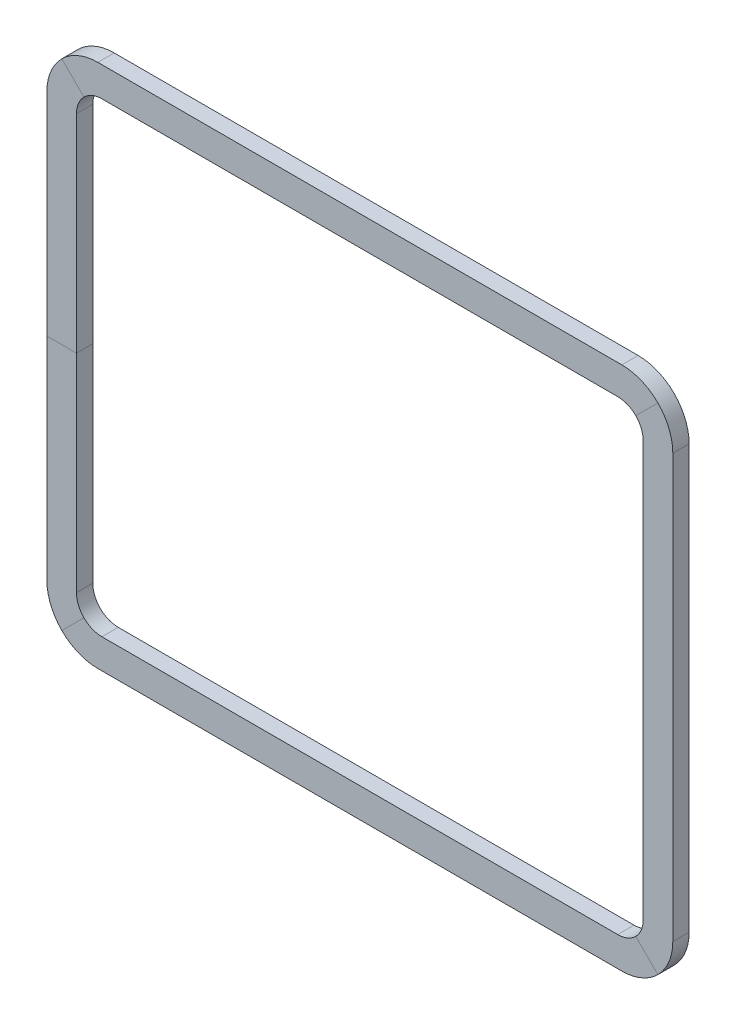
ISO-10303-21;
HEADER;
FILE_DESCRIPTION(('STEP AP214'),'2;1');
FILE_NAME('part.step','',(''),(''),'','','');
FILE_SCHEMA(('AUTOMOTIVE_DESIGN { 1 0 10303 214 1 1 1 1 }'));
ENDSEC;
DATA;
#1=APPLICATION_CONTEXT('core data for automotive mechanical design processes');
#2=APPLICATION_PROTOCOL_DEFINITION('international standard','automotive_design',2000,#1);
#3=PRODUCT_CONTEXT('',#1,'mechanical');
#4=PRODUCT('Part','Part','',(#3));
#5=PRODUCT_RELATED_PRODUCT_CATEGORY('part','',(#4));
#6=PRODUCT_DEFINITION_FORMATION('','',#4);
#7=PRODUCT_DEFINITION_CONTEXT('part definition',#1,'design');
#8=PRODUCT_DEFINITION('design','',#6,#7);
#9=PRODUCT_DEFINITION_SHAPE('','',#8);
#10=(LENGTH_UNIT() NAMED_UNIT(*) SI_UNIT(.MILLI.,.METRE.));
#11=(NAMED_UNIT(*) PLANE_ANGLE_UNIT() SI_UNIT($,.RADIAN.));
#12=(NAMED_UNIT(*) SI_UNIT($,.STERADIAN.) SOLID_ANGLE_UNIT());
#13=UNCERTAINTY_MEASURE_WITH_UNIT(LENGTH_MEASURE(1.E-05),#10,'distance_accuracy_value','');
#14=(GEOMETRIC_REPRESENTATION_CONTEXT(3) GLOBAL_UNCERTAINTY_ASSIGNED_CONTEXT((#13)) GLOBAL_UNIT_ASSIGNED_CONTEXT((#10,
#11,#12)) REPRESENTATION_CONTEXT('',''));
#15=CARTESIAN_POINT('',(0.,0.,0.));
#16=DIRECTION('',(0.,0.,1.));
#17=DIRECTION('',(1.,0.,0.));
#18=AXIS2_PLACEMENT_3D('',#15,#16,#17);
#19=CARTESIAN_POINT('',(30.7,-25.75,1.6));
#20=DIRECTION('',(0.,-1.,0.));
#21=DIRECTION('',(0.,0.,-1.));
#22=AXIS2_PLACEMENT_3D('',#19,#20,#21);
#23=PLANE('',#22);
#24=DIRECTION('',(-1.,0.,0.));
#25=VECTOR('',#24,1.);
#26=CARTESIAN_POINT('',(30.7,-25.75,0.));
#27=LINE('',#26,#25);
#28=CARTESIAN_POINT('',(25.7,-25.75,0.));
#29=VERTEX_POINT('',#28);
#30=CARTESIAN_POINT('',(-25.7,-25.75,0.));
#31=VERTEX_POINT('',#30);
#32=EDGE_CURVE('E261',#29,#31,#27,.T.);
#33=ORIENTED_EDGE('',*,*,#32,.F.);
#34=DIRECTION('',(0.,0.,1.));
#35=VECTOR('',#34,1.);
#36=CARTESIAN_POINT('',(25.7,-25.75,1.6));
#37=LINE('',#36,#35);
#38=CARTESIAN_POINT('',(25.7,-25.75,1.6));
#39=VERTEX_POINT('',#38);
#40=EDGE_CURVE('E307',#29,#39,#37,.T.);
#41=ORIENTED_EDGE('',*,*,#40,.T.);
#42=DIRECTION('',(-1.,0.,0.));
#43=VECTOR('',#42,1.);
#44=CARTESIAN_POINT('',(30.7,-25.75,1.6));
#45=LINE('',#44,#43);
#46=CARTESIAN_POINT('',(-25.7,-25.75,1.6));
#47=VERTEX_POINT('',#46);
#48=EDGE_CURVE('E218',#39,#47,#45,.T.);
#49=ORIENTED_EDGE('',*,*,#48,.T.);
#50=DIRECTION('',(0.,0.,1.));
#51=VECTOR('',#50,1.);
#52=CARTESIAN_POINT('',(-25.7,-25.75,1.6));
#53=LINE('',#52,#51);
#54=EDGE_CURVE('E305',#47,#31,#53,.F.);
#55=ORIENTED_EDGE('',*,*,#54,.T.);
#56=EDGE_LOOP('',(#33,#41,#49,#55));
#57=FACE_BOUND('',#56,.T.);
#58=ADVANCED_FACE('F33',(#57),#23,.T.);
#59=CARTESIAN_POINT('',(30.7,-22.85,1.6));
#60=DIRECTION('',(0.,1.,0.));
#61=DIRECTION('',(0.,0.,1.));
#62=AXIS2_PLACEMENT_3D('',#59,#60,#61);
#63=PLANE('',#62);
#64=DIRECTION('',(-1.,0.,0.));
#65=VECTOR('',#64,1.);
#66=CARTESIAN_POINT('',(30.7,-22.85,1.6));
#67=LINE('',#66,#65);
#68=CARTESIAN_POINT('',(25.3,-22.85,1.6));
#69=VERTEX_POINT('',#68);
#70=CARTESIAN_POINT('',(-25.3,-22.85,1.6));
#71=VERTEX_POINT('',#70);
#72=EDGE_CURVE('E267',#69,#71,#67,.T.);
#73=ORIENTED_EDGE('',*,*,#72,.F.);
#74=DIRECTION('',(0.,0.,1.));
#75=VECTOR('',#74,1.);
#76=CARTESIAN_POINT('',(25.3,-22.85,0.));
#77=LINE('',#76,#75);
#78=CARTESIAN_POINT('',(25.3,-22.85,0.));
#79=VERTEX_POINT('',#78);
#80=EDGE_CURVE('E338',#69,#79,#77,.F.);
#81=ORIENTED_EDGE('',*,*,#80,.T.);
#82=DIRECTION('',(-1.,0.,0.));
#83=VECTOR('',#82,1.);
#84=CARTESIAN_POINT('',(30.7,-22.85,0.));
#85=LINE('',#84,#83);
#86=CARTESIAN_POINT('',(-25.3,-22.85,0.));
#87=VERTEX_POINT('',#86);
#88=EDGE_CURVE('E264',#79,#87,#85,.T.);
#89=ORIENTED_EDGE('',*,*,#88,.T.);
#90=DIRECTION('',(0.,0.,1.));
#91=VECTOR('',#90,1.);
#92=CARTESIAN_POINT('',(-25.3,-22.85,1.6));
#93=LINE('',#92,#91);
#94=EDGE_CURVE('E335',#87,#71,#93,.T.);
#95=ORIENTED_EDGE('',*,*,#94,.T.);
#96=EDGE_LOOP('',(#73,#81,#89,#95));
#97=FACE_BOUND('',#96,.T.);
#98=ADVANCED_FACE('F462',(#97),#63,.T.);
#99=CARTESIAN_POINT('',(30.7,-22.85,0.));
#100=DIRECTION('',(0.,0.,-1.));
#101=DIRECTION('',(-1.,0.,0.));
#102=AXIS2_PLACEMENT_3D('',#99,#100,#101);
#103=PLANE('',#102);
#104=DIRECTION('',(-0.707106781186548,0.707106781186547,0.));
#105=VECTOR('',#104,1.);
#106=CARTESIAN_POINT('',(3.5,1.45000000000001,0.));
#107=LINE('',#106,#105);
#108=CARTESIAN_POINT('',(29.2355339059328,-24.2855339059327,0.));
#109=VERTEX_POINT('',#108);
#110=CARTESIAN_POINT('',(27.0677669529664,-22.1177669529664,0.));
#111=VERTEX_POINT('',#110);
#112=EDGE_CURVE('E419',#109,#111,#107,.T.);
#113=ORIENTED_EDGE('',*,*,#112,.F.);
#114=CARTESIAN_POINT('',(25.7,-20.75,0.));
#115=DIRECTION('',(0.,0.,-1.));
#116=DIRECTION('',(-1.,0.,0.));
#117=AXIS2_PLACEMENT_3D('',#114,#115,#116);
#118=CIRCLE('',#117,5.);
#119=EDGE_CURVE('E316',#109,#29,#118,.T.);
#120=ORIENTED_EDGE('',*,*,#119,.T.);
#121=ORIENTED_EDGE('',*,*,#32,.T.);
#122=CARTESIAN_POINT('',(-25.7,-20.75,0.));
#123=DIRECTION('',(0.,0.,-1.));
#124=DIRECTION('',(-1.,0.,0.));
#125=AXIS2_PLACEMENT_3D('',#122,#123,#124);
#126=CIRCLE('',#125,5.);
#127=CARTESIAN_POINT('',(-29.2355339059327,-24.2855339059327,0.));
#128=VERTEX_POINT('',#127);
#129=EDGE_CURVE('E314',#31,#128,#126,.T.);
#130=ORIENTED_EDGE('',*,*,#129,.T.);
#131=DIRECTION('',(0.707106781186548,0.707106781186548,0.));
#132=VECTOR('',#131,1.);
#133=CARTESIAN_POINT('',(-29.25,-24.3,0.));
#134=LINE('',#133,#132);
#135=CARTESIAN_POINT('',(-27.0677669529664,-22.1177669529664,0.));
#136=VERTEX_POINT('',#135);
#137=EDGE_CURVE('E408',#128,#136,#134,.T.);
#138=ORIENTED_EDGE('',*,*,#137,.T.);
#139=CARTESIAN_POINT('',(-25.3,-20.35,0.));
#140=DIRECTION('',(0.,0.,-1.));
#141=DIRECTION('',(-1.,0.,0.));
#142=AXIS2_PLACEMENT_3D('',#139,#140,#141);
#143=CIRCLE('',#142,2.5);
#144=EDGE_CURVE('E370',#136,#87,#143,.F.);
#145=ORIENTED_EDGE('',*,*,#144,.T.);
#146=ORIENTED_EDGE('',*,*,#88,.F.);
#147=CARTESIAN_POINT('',(25.3,-20.35,0.));
#148=DIRECTION('',(0.,0.,-1.));
#149=DIRECTION('',(-1.,0.,0.));
#150=AXIS2_PLACEMENT_3D('',#147,#148,#149);
#151=CIRCLE('',#150,2.5);
#152=EDGE_CURVE('E358',#79,#111,#151,.F.);
#153=ORIENTED_EDGE('',*,*,#152,.T.);
#154=EDGE_LOOP('',(#113,#120,#121,#130,#138,#145,#146,#153));
#155=FACE_BOUND('',#154,.T.);
#156=ADVANCED_FACE('F417',(#155),#103,.T.);
#157=CARTESIAN_POINT('',(30.7,-22.85,1.6));
#158=DIRECTION('',(0.,0.,1.));
#159=DIRECTION('',(1.,0.,0.));
#160=AXIS2_PLACEMENT_3D('',#157,#158,#159);
#161=PLANE('',#160);
#162=ORIENTED_EDGE('',*,*,#48,.F.);
#163=CARTESIAN_POINT('',(25.7,-20.75,1.6));
#164=DIRECTION('',(0.,0.,1.));
#165=DIRECTION('',(1.,0.,0.));
#166=AXIS2_PLACEMENT_3D('',#163,#164,#165);
#167=CIRCLE('',#166,5.);
#168=CARTESIAN_POINT('',(29.2355339059328,-24.2855339059327,1.6));
#169=VERTEX_POINT('',#168);
#170=EDGE_CURVE('E312',#39,#169,#167,.T.);
#171=ORIENTED_EDGE('',*,*,#170,.T.);
#172=DIRECTION('',(0.707106781186548,-0.707106781186547,0.));
#173=VECTOR('',#172,1.);
#174=CARTESIAN_POINT('',(3.5,1.45000000000001,1.6));
#175=LINE('',#174,#173);
#176=CARTESIAN_POINT('',(27.0677669529664,-22.1177669529664,1.6));
#177=VERTEX_POINT('',#176);
#178=EDGE_CURVE('E426',#177,#169,#175,.T.);
#179=ORIENTED_EDGE('',*,*,#178,.F.);
#180=CARTESIAN_POINT('',(25.3,-20.35,1.6));
#181=DIRECTION('',(0.,0.,1.));
#182=DIRECTION('',(1.,0.,0.));
#183=AXIS2_PLACEMENT_3D('',#180,#181,#182);
#184=CIRCLE('',#183,2.5);
#185=EDGE_CURVE('E356',#177,#69,#184,.F.);
#186=ORIENTED_EDGE('',*,*,#185,.T.);
#187=ORIENTED_EDGE('',*,*,#72,.T.);
#188=CARTESIAN_POINT('',(-25.3,-20.35,1.6));
#189=DIRECTION('',(0.,0.,1.));
#190=DIRECTION('',(1.,0.,0.));
#191=AXIS2_PLACEMENT_3D('',#188,#189,#190);
#192=CIRCLE('',#191,2.5);
#193=CARTESIAN_POINT('',(-27.0677669529664,-22.1177669529664,1.6));
#194=VERTEX_POINT('',#193);
#195=EDGE_CURVE('E363',#71,#194,#192,.F.);
#196=ORIENTED_EDGE('',*,*,#195,.T.);
#197=DIRECTION('',(-0.707106781186548,-0.707106781186548,0.));
#198=VECTOR('',#197,1.);
#199=CARTESIAN_POINT('',(-29.25,-24.3,1.6));
#200=LINE('',#199,#198);
#201=CARTESIAN_POINT('',(-29.2355339059327,-24.2855339059327,1.6));
#202=VERTEX_POINT('',#201);
#203=EDGE_CURVE('E247',#194,#202,#200,.T.);
#204=ORIENTED_EDGE('',*,*,#203,.T.);
#205=CARTESIAN_POINT('',(-25.7,-20.75,1.6));
#206=DIRECTION('',(0.,0.,1.));
#207=DIRECTION('',(1.,0.,0.));
#208=AXIS2_PLACEMENT_3D('',#205,#206,#207);
#209=CIRCLE('',#208,5.);
#210=EDGE_CURVE('E310',#202,#47,#209,.T.);
#211=ORIENTED_EDGE('',*,*,#210,.T.);
#212=EDGE_LOOP('',(#162,#171,#179,#186,#187,#196,#204,#211));
#213=FACE_BOUND('',#212,.T.);
#214=ADVANCED_FACE('F407',(#213),#161,.T.);
#215=CARTESIAN_POINT('',(-27.8,-25.75,1.6));
#216=DIRECTION('',(1.,0.,0.));
#217=DIRECTION('',(0.,1.,0.));
#218=AXIS2_PLACEMENT_3D('',#215,#216,#217);
#219=PLANE('',#218);
#220=DIRECTION('',(0.,1.,0.));
#221=VECTOR('',#220,1.);
#222=CARTESIAN_POINT('',(-27.8,-25.75,1.6));
#223=LINE('',#222,#221);
#224=CARTESIAN_POINT('',(-27.8,-20.35,1.6));
#225=VERTEX_POINT('',#224);
#226=CARTESIAN_POINT('',(-27.8,0.,1.6));
#227=VERTEX_POINT('',#226);
#228=EDGE_CURVE('E205',#225,#227,#223,.T.);
#229=ORIENTED_EDGE('',*,*,#228,.F.);
#230=DIRECTION('',(0.,0.,1.));
#231=VECTOR('',#230,1.);
#232=CARTESIAN_POINT('',(-27.8,-20.35,0.));
#233=LINE('',#232,#231);
#234=CARTESIAN_POINT('',(-27.8,-20.35,0.));
#235=VERTEX_POINT('',#234);
#236=EDGE_CURVE('E340',#225,#235,#233,.F.);
#237=ORIENTED_EDGE('',*,*,#236,.T.);
#238=DIRECTION('',(0.,1.,0.));
#239=VECTOR('',#238,1.);
#240=CARTESIAN_POINT('',(-27.8,-25.75,0.));
#241=LINE('',#240,#239);
#242=CARTESIAN_POINT('',(-27.8,0.,0.));
#243=VERTEX_POINT('',#242);
#244=EDGE_CURVE('E240',#235,#243,#241,.T.);
#245=ORIENTED_EDGE('',*,*,#244,.T.);
#246=DIRECTION('',(0.,0.,-1.));
#247=VECTOR('',#246,1.);
#248=CARTESIAN_POINT('',(-27.8,0.,1.6));
#249=LINE('',#248,#247);
#250=EDGE_CURVE('E217',#227,#243,#249,.T.);
#251=ORIENTED_EDGE('',*,*,#250,.F.);
#252=EDGE_LOOP('',(#229,#237,#245,#251));
#253=FACE_BOUND('',#252,.T.);
#254=ADVANCED_FACE('F238',(#253),#219,.T.);
#255=CARTESIAN_POINT('',(-27.8,-25.75,0.));
#256=DIRECTION('',(0.,0.,-1.));
#257=DIRECTION('',(-1.,0.,0.));
#258=AXIS2_PLACEMENT_3D('',#255,#256,#257);
#259=PLANE('',#258);
#260=ORIENTED_EDGE('',*,*,#137,.F.);
#261=CARTESIAN_POINT('',(-25.7,-20.75,0.));
#262=DIRECTION('',(0.,0.,-1.));
#263=DIRECTION('',(-1.,0.,0.));
#264=AXIS2_PLACEMENT_3D('',#261,#262,#263);
#265=CIRCLE('',#264,5.);
#266=CARTESIAN_POINT('',(-30.7,-20.75,0.));
#267=VERTEX_POINT('',#266);
#268=EDGE_CURVE('E323',#128,#267,#265,.T.);
#269=ORIENTED_EDGE('',*,*,#268,.T.);
#270=DIRECTION('',(0.,1.,0.));
#271=VECTOR('',#270,1.);
#272=CARTESIAN_POINT('',(-30.7,-25.75,0.));
#273=LINE('',#272,#271);
#274=CARTESIAN_POINT('',(-30.7,0.,0.));
#275=VERTEX_POINT('',#274);
#276=EDGE_CURVE('E251',#267,#275,#273,.T.);
#277=ORIENTED_EDGE('',*,*,#276,.T.);
#278=DIRECTION('',(-1.,0.,0.));
#279=VECTOR('',#278,1.);
#280=CARTESIAN_POINT('',(-27.8,0.,0.));
#281=LINE('',#280,#279);
#282=EDGE_CURVE('E243',#243,#275,#281,.T.);
#283=ORIENTED_EDGE('',*,*,#282,.F.);
#284=ORIENTED_EDGE('',*,*,#244,.F.);
#285=CARTESIAN_POINT('',(-25.3,-20.35,0.));
#286=DIRECTION('',(0.,0.,-1.));
#287=DIRECTION('',(-1.,0.,0.));
#288=AXIS2_PLACEMENT_3D('',#285,#286,#287);
#289=CIRCLE('',#288,2.5);
#290=EDGE_CURVE('E367',#235,#136,#289,.F.);
#291=ORIENTED_EDGE('',*,*,#290,.T.);
#292=EDGE_LOOP('',(#260,#269,#277,#283,#284,#291));
#293=FACE_BOUND('',#292,.T.);
#294=ADVANCED_FACE('F389',(#293),#259,.T.);
#295=CARTESIAN_POINT('',(-30.7,-25.75,1.6));
#296=DIRECTION('',(-1.,0.,0.));
#297=DIRECTION('',(0.,-1.,0.));
#298=AXIS2_PLACEMENT_3D('',#295,#296,#297);
#299=PLANE('',#298);
#300=ORIENTED_EDGE('',*,*,#276,.F.);
#301=DIRECTION('',(0.,0.,1.));
#302=VECTOR('',#301,1.);
#303=CARTESIAN_POINT('',(-30.7,-20.75,1.6));
#304=LINE('',#303,#302);
#305=CARTESIAN_POINT('',(-30.7,-20.75,1.6));
#306=VERTEX_POINT('',#305);
#307=EDGE_CURVE('E318',#267,#306,#304,.T.);
#308=ORIENTED_EDGE('',*,*,#307,.T.);
#309=DIRECTION('',(0.,1.,0.));
#310=VECTOR('',#309,1.);
#311=CARTESIAN_POINT('',(-30.7,-25.75,1.6));
#312=LINE('',#311,#310);
#313=CARTESIAN_POINT('',(-30.7,0.,1.6));
#314=VERTEX_POINT('',#313);
#315=EDGE_CURVE('E236',#306,#314,#312,.T.);
#316=ORIENTED_EDGE('',*,*,#315,.T.);
#317=DIRECTION('',(0.,0.,1.));
#318=VECTOR('',#317,1.);
#319=CARTESIAN_POINT('',(-30.7,0.,1.6));
#320=LINE('',#319,#318);
#321=EDGE_CURVE('E253',#275,#314,#320,.T.);
#322=ORIENTED_EDGE('',*,*,#321,.F.);
#323=EDGE_LOOP('',(#300,#308,#316,#322));
#324=FACE_BOUND('',#323,.T.);
#325=ADVANCED_FACE('F401',(#324),#299,.T.);
#326=CARTESIAN_POINT('',(-27.8,-25.75,1.6));
#327=DIRECTION('',(0.,0.,1.));
#328=DIRECTION('',(1.,0.,0.));
#329=AXIS2_PLACEMENT_3D('',#326,#327,#328);
#330=PLANE('',#329);
#331=ORIENTED_EDGE('',*,*,#315,.F.);
#332=CARTESIAN_POINT('',(-25.7,-20.75,1.6));
#333=DIRECTION('',(0.,0.,1.));
#334=DIRECTION('',(1.,0.,0.));
#335=AXIS2_PLACEMENT_3D('',#332,#333,#334);
#336=CIRCLE('',#335,5.);
#337=EDGE_CURVE('E321',#306,#202,#336,.T.);
#338=ORIENTED_EDGE('',*,*,#337,.T.);
#339=ORIENTED_EDGE('',*,*,#203,.F.);
#340=CARTESIAN_POINT('',(-25.3,-20.35,1.6));
#341=DIRECTION('',(0.,0.,1.));
#342=DIRECTION('',(1.,0.,0.));
#343=AXIS2_PLACEMENT_3D('',#340,#341,#342);
#344=CIRCLE('',#343,2.5);
#345=EDGE_CURVE('E213',#194,#225,#344,.F.);
#346=ORIENTED_EDGE('',*,*,#345,.T.);
#347=ORIENTED_EDGE('',*,*,#228,.T.);
#348=DIRECTION('',(1.,0.,0.));
#349=VECTOR('',#348,1.);
#350=CARTESIAN_POINT('',(-27.8,0.,1.6));
#351=LINE('',#350,#349);
#352=EDGE_CURVE('E210',#314,#227,#351,.T.);
#353=ORIENTED_EDGE('',*,*,#352,.F.);
#354=EDGE_LOOP('',(#331,#338,#339,#346,#347,#353));
#355=FACE_BOUND('',#354,.T.);
#356=ADVANCED_FACE('F208',(#355),#330,.T.);
#357=CARTESIAN_POINT('',(-30.7,0.,1.6));
#358=DIRECTION('',(-1.,0.,0.));
#359=DIRECTION('',(0.,-1.,0.));
#360=AXIS2_PLACEMENT_3D('',#357,#358,#359);
#361=PLANE('',#360);
#362=DIRECTION('',(0.,1.,0.));
#363=VECTOR('',#362,1.);
#364=CARTESIAN_POINT('',(-30.7,0.,1.6));
#365=LINE('',#364,#363);
#366=CARTESIAN_POINT('',(-30.7,20.75,1.6));
#367=VERTEX_POINT('',#366);
#368=EDGE_CURVE('E235',#314,#367,#365,.T.);
#369=ORIENTED_EDGE('',*,*,#368,.T.);
#370=DIRECTION('',(0.,0.,1.));
#371=VECTOR('',#370,1.);
#372=CARTESIAN_POINT('',(-30.7,20.75,1.6));
#373=LINE('',#372,#371);
#374=CARTESIAN_POINT('',(-30.7,20.75,0.));
#375=VERTEX_POINT('',#374);
#376=EDGE_CURVE('E284',#367,#375,#373,.F.);
#377=ORIENTED_EDGE('',*,*,#376,.T.);
#378=DIRECTION('',(0.,1.,0.));
#379=VECTOR('',#378,1.);
#380=CARTESIAN_POINT('',(-30.7,0.,0.));
#381=LINE('',#380,#379);
#382=EDGE_CURVE('E254',#275,#375,#381,.T.);
#383=ORIENTED_EDGE('',*,*,#382,.F.);
#384=ORIENTED_EDGE('',*,*,#321,.T.);
#385=EDGE_LOOP('',(#369,#377,#383,#384));
#386=FACE_BOUND('',#385,.T.);
#387=ADVANCED_FACE('F398',(#386),#361,.T.);
#388=CARTESIAN_POINT('',(-27.8,0.,1.6));
#389=DIRECTION('',(1.,0.,0.));
#390=DIRECTION('',(0.,1.,0.));
#391=AXIS2_PLACEMENT_3D('',#388,#389,#390);
#392=PLANE('',#391);
#393=DIRECTION('',(0.,1.,0.));
#394=VECTOR('',#393,1.);
#395=CARTESIAN_POINT('',(-27.8,0.,0.));
#396=LINE('',#395,#394);
#397=CARTESIAN_POINT('',(-27.8,20.35,0.));
#398=VERTEX_POINT('',#397);
#399=EDGE_CURVE('E230',#243,#398,#396,.T.);
#400=ORIENTED_EDGE('',*,*,#399,.T.);
#401=DIRECTION('',(0.,0.,1.));
#402=VECTOR('',#401,1.);
#403=CARTESIAN_POINT('',(-27.8,20.35,1.6));
#404=LINE('',#403,#402);
#405=CARTESIAN_POINT('',(-27.8,20.35,1.6));
#406=VERTEX_POINT('',#405);
#407=EDGE_CURVE('E228',#398,#406,#404,.T.);
#408=ORIENTED_EDGE('',*,*,#407,.T.);
#409=DIRECTION('',(0.,1.,0.));
#410=VECTOR('',#409,1.);
#411=CARTESIAN_POINT('',(-27.8,0.,1.6));
#412=LINE('',#411,#410);
#413=EDGE_CURVE('E224',#227,#406,#412,.T.);
#414=ORIENTED_EDGE('',*,*,#413,.F.);
#415=ORIENTED_EDGE('',*,*,#250,.T.);
#416=EDGE_LOOP('',(#400,#408,#414,#415));
#417=FACE_BOUND('',#416,.T.);
#418=ADVANCED_FACE('F226',(#417),#392,.T.);
#419=CARTESIAN_POINT('',(-27.8,0.,0.));
#420=DIRECTION('',(0.,0.,-1.));
#421=DIRECTION('',(-1.,0.,0.));
#422=AXIS2_PLACEMENT_3D('',#419,#420,#421);
#423=PLANE('',#422);
#424=ORIENTED_EDGE('',*,*,#382,.T.);
#425=CARTESIAN_POINT('',(-25.7,20.75,0.));
#426=DIRECTION('',(0.,0.,-1.));
#427=DIRECTION('',(-1.,0.,0.));
#428=AXIS2_PLACEMENT_3D('',#425,#426,#427);
#429=CIRCLE('',#428,5.);
#430=CARTESIAN_POINT('',(-29.2355339059327,24.2855339059327,0.));
#431=VERTEX_POINT('',#430);
#432=EDGE_CURVE('E286',#375,#431,#429,.T.);
#433=ORIENTED_EDGE('',*,*,#432,.T.);
#434=DIRECTION('',(0.707106781186548,-0.707106781186547,0.));
#435=VECTOR('',#434,1.);
#436=CARTESIAN_POINT('',(-29.25,24.3,0.));
#437=LINE('',#436,#435);
#438=CARTESIAN_POINT('',(-27.0677669529664,22.1177669529664,0.));
#439=VERTEX_POINT('',#438);
#440=EDGE_CURVE('E47',#431,#439,#437,.T.);
#441=ORIENTED_EDGE('',*,*,#440,.T.);
#442=CARTESIAN_POINT('',(-25.3,20.35,0.));
#443=DIRECTION('',(0.,0.,-1.));
#444=DIRECTION('',(-1.,0.,0.));
#445=AXIS2_PLACEMENT_3D('',#442,#443,#444);
#446=CIRCLE('',#445,2.5);
#447=EDGE_CURVE('E11',#439,#398,#446,.F.);
#448=ORIENTED_EDGE('',*,*,#447,.T.);
#449=ORIENTED_EDGE('',*,*,#399,.F.);
#450=ORIENTED_EDGE('',*,*,#282,.T.);
#451=EDGE_LOOP('',(#424,#433,#441,#448,#449,#450));
#452=FACE_BOUND('',#451,.T.);
#453=ADVANCED_FACE('F385',(#452),#423,.T.);
#454=CARTESIAN_POINT('',(-27.8,0.,1.6));
#455=DIRECTION('',(0.,0.,1.));
#456=DIRECTION('',(1.,0.,0.));
#457=AXIS2_PLACEMENT_3D('',#454,#455,#456);
#458=PLANE('',#457);
#459=DIRECTION('',(-0.707106781186548,0.707106781186547,0.));
#460=VECTOR('',#459,1.);
#461=CARTESIAN_POINT('',(-29.25,24.3,1.6));
#462=LINE('',#461,#460);
#463=CARTESIAN_POINT('',(-27.0677669529664,22.1177669529664,1.6));
#464=VERTEX_POINT('',#463);
#465=CARTESIAN_POINT('',(-29.2355339059327,24.2855339059327,1.6));
#466=VERTEX_POINT('',#465);
#467=EDGE_CURVE('E55',#464,#466,#462,.T.);
#468=ORIENTED_EDGE('',*,*,#467,.T.);
#469=CARTESIAN_POINT('',(-25.7,20.75,1.6));
#470=DIRECTION('',(0.,0.,1.));
#471=DIRECTION('',(1.,0.,0.));
#472=AXIS2_PLACEMENT_3D('',#469,#470,#471);
#473=CIRCLE('',#472,5.);
#474=EDGE_CURVE('E282',#466,#367,#473,.T.);
#475=ORIENTED_EDGE('',*,*,#474,.T.);
#476=ORIENTED_EDGE('',*,*,#368,.F.);
#477=ORIENTED_EDGE('',*,*,#352,.T.);
#478=ORIENTED_EDGE('',*,*,#413,.T.);
#479=CARTESIAN_POINT('',(-25.3,20.35,1.6));
#480=DIRECTION('',(0.,0.,1.));
#481=DIRECTION('',(1.,0.,0.));
#482=AXIS2_PLACEMENT_3D('',#479,#480,#481);
#483=CIRCLE('',#482,2.5);
#484=EDGE_CURVE('E372',#406,#464,#483,.F.);
#485=ORIENTED_EDGE('',*,*,#484,.T.);
#486=EDGE_LOOP('',(#468,#475,#476,#477,#478,#485));
#487=FACE_BOUND('',#486,.T.);
#488=ADVANCED_FACE('F233',(#487),#458,.T.);
#489=CARTESIAN_POINT('',(30.7,25.75,1.6));
#490=DIRECTION('',(1.,0.,0.));
#491=DIRECTION('',(0.,1.,0.));
#492=AXIS2_PLACEMENT_3D('',#489,#490,#491);
#493=PLANE('',#492);
#494=DIRECTION('',(0.,-1.,0.));
#495=VECTOR('',#494,1.);
#496=CARTESIAN_POINT('',(30.7,25.75,0.));
#497=LINE('',#496,#495);
#498=CARTESIAN_POINT('',(30.7,20.75,0.));
#499=VERTEX_POINT('',#498);
#500=CARTESIAN_POINT('',(30.7,-20.75,0.));
#501=VERTEX_POINT('',#500);
#502=EDGE_CURVE('E438',#499,#501,#497,.T.);
#503=ORIENTED_EDGE('',*,*,#502,.F.);
#504=DIRECTION('',(0.,0.,1.));
#505=VECTOR('',#504,1.);
#506=CARTESIAN_POINT('',(30.7,20.75,1.6));
#507=LINE('',#506,#505);
#508=CARTESIAN_POINT('',(30.7,20.75,1.6));
#509=VERTEX_POINT('',#508);
#510=EDGE_CURVE('E294',#499,#509,#507,.T.);
#511=ORIENTED_EDGE('',*,*,#510,.T.);
#512=DIRECTION('',(0.,-1.,0.));
#513=VECTOR('',#512,1.);
#514=CARTESIAN_POINT('',(30.7,25.75,1.6));
#515=LINE('',#514,#513);
#516=CARTESIAN_POINT('',(30.7,-20.75,1.6));
#517=VERTEX_POINT('',#516);
#518=EDGE_CURVE('E440',#509,#517,#515,.T.);
#519=ORIENTED_EDGE('',*,*,#518,.T.);
#520=DIRECTION('',(0.,0.,1.));
#521=VECTOR('',#520,1.);
#522=CARTESIAN_POINT('',(30.7,-20.75,1.6));
#523=LINE('',#522,#521);
#524=EDGE_CURVE('E292',#517,#501,#523,.F.);
#525=ORIENTED_EDGE('',*,*,#524,.T.);
#526=EDGE_LOOP('',(#503,#511,#519,#525));
#527=FACE_BOUND('',#526,.T.);
#528=ADVANCED_FACE('F437',(#527),#493,.T.);
#529=CARTESIAN_POINT('',(27.8,25.75,1.6));
#530=DIRECTION('',(-1.,0.,0.));
#531=DIRECTION('',(0.,-1.,0.));
#532=AXIS2_PLACEMENT_3D('',#529,#530,#531);
#533=PLANE('',#532);
#534=DIRECTION('',(0.,-1.,0.));
#535=VECTOR('',#534,1.);
#536=CARTESIAN_POINT('',(27.8,25.75,1.6));
#537=LINE('',#536,#535);
#538=CARTESIAN_POINT('',(27.8,20.35,1.6));
#539=VERTEX_POINT('',#538);
#540=CARTESIAN_POINT('',(27.8,-20.35,1.6));
#541=VERTEX_POINT('',#540);
#542=EDGE_CURVE('E449',#539,#541,#537,.T.);
#543=ORIENTED_EDGE('',*,*,#542,.F.);
#544=DIRECTION('',(0.,0.,1.));
#545=VECTOR('',#544,1.);
#546=CARTESIAN_POINT('',(27.8,20.35,0.));
#547=LINE('',#546,#545);
#548=CARTESIAN_POINT('',(27.8,20.35,0.));
#549=VERTEX_POINT('',#548);
#550=EDGE_CURVE('E333',#539,#549,#547,.F.);
#551=ORIENTED_EDGE('',*,*,#550,.T.);
#552=DIRECTION('',(0.,-1.,0.));
#553=VECTOR('',#552,1.);
#554=CARTESIAN_POINT('',(27.8,25.75,0.));
#555=LINE('',#554,#553);
#556=CARTESIAN_POINT('',(27.8,-20.35,0.));
#557=VERTEX_POINT('',#556);
#558=EDGE_CURVE('E445',#549,#557,#555,.T.);
#559=ORIENTED_EDGE('',*,*,#558,.T.);
#560=DIRECTION('',(0.,0.,1.));
#561=VECTOR('',#560,1.);
#562=CARTESIAN_POINT('',(27.8,-20.35,1.6));
#563=LINE('',#562,#561);
#564=EDGE_CURVE('E330',#557,#541,#563,.T.);
#565=ORIENTED_EDGE('',*,*,#564,.T.);
#566=EDGE_LOOP('',(#543,#551,#559,#565));
#567=FACE_BOUND('',#566,.T.);
#568=ADVANCED_FACE('F473',(#567),#533,.T.);
#569=CARTESIAN_POINT('',(27.8,25.75,0.));
#570=DIRECTION('',(0.,0.,-1.));
#571=DIRECTION('',(-1.,0.,0.));
#572=AXIS2_PLACEMENT_3D('',#569,#570,#571);
#573=PLANE('',#572);
#574=DIRECTION('',(-0.707106781186547,-0.707106781186548,0.));
#575=VECTOR('',#574,1.);
#576=CARTESIAN_POINT('',(-1.44999999999999,-6.39999999999999,0.));
#577=LINE('',#576,#575);
#578=CARTESIAN_POINT('',(29.2355339059327,24.2855339059327,0.));
#579=VERTEX_POINT('',#578);
#580=CARTESIAN_POINT('',(27.0677669529664,22.1177669529664,0.));
#581=VERTEX_POINT('',#580);
#582=EDGE_CURVE('E480',#579,#581,#577,.T.);
#583=ORIENTED_EDGE('',*,*,#582,.F.);
#584=CARTESIAN_POINT('',(25.7,20.75,0.));
#585=DIRECTION('',(0.,0.,-1.));
#586=DIRECTION('',(-1.,0.,0.));
#587=AXIS2_PLACEMENT_3D('',#584,#585,#586);
#588=CIRCLE('',#587,5.);
#589=EDGE_CURVE('E303',#579,#499,#588,.T.);
#590=ORIENTED_EDGE('',*,*,#589,.T.);
#591=ORIENTED_EDGE('',*,*,#502,.T.);
#592=CARTESIAN_POINT('',(25.7,-20.75,0.));
#593=DIRECTION('',(0.,0.,-1.));
#594=DIRECTION('',(-1.,0.,0.));
#595=AXIS2_PLACEMENT_3D('',#592,#593,#594);
#596=CIRCLE('',#595,5.);
#597=EDGE_CURVE('E301',#501,#109,#596,.T.);
#598=ORIENTED_EDGE('',*,*,#597,.T.);
#599=ORIENTED_EDGE('',*,*,#112,.T.);
#600=CARTESIAN_POINT('',(25.3,-20.35,0.));
#601=DIRECTION('',(0.,0.,-1.));
#602=DIRECTION('',(-1.,0.,0.));
#603=AXIS2_PLACEMENT_3D('',#600,#601,#602);
#604=CIRCLE('',#603,2.5);
#605=EDGE_CURVE('E361',#111,#557,#604,.F.);
#606=ORIENTED_EDGE('',*,*,#605,.T.);
#607=ORIENTED_EDGE('',*,*,#558,.F.);
#608=CARTESIAN_POINT('',(25.3,20.35,0.));
#609=DIRECTION('',(0.,0.,-1.));
#610=DIRECTION('',(-1.,0.,0.));
#611=AXIS2_PLACEMENT_3D('',#608,#609,#610);
#612=CIRCLE('',#611,2.5);
#613=EDGE_CURVE('E348',#549,#581,#612,.F.);
#614=ORIENTED_EDGE('',*,*,#613,.T.);
#615=EDGE_LOOP('',(#583,#590,#591,#598,#599,#606,#607,#614));
#616=FACE_BOUND('',#615,.T.);
#617=ADVANCED_FACE('F443',(#616),#573,.T.);
#618=CARTESIAN_POINT('',(27.8,25.75,1.6));
#619=DIRECTION('',(0.,0.,1.));
#620=DIRECTION('',(1.,0.,0.));
#621=AXIS2_PLACEMENT_3D('',#618,#619,#620);
#622=PLANE('',#621);
#623=ORIENTED_EDGE('',*,*,#518,.F.);
#624=CARTESIAN_POINT('',(25.7,20.75,1.6));
#625=DIRECTION('',(0.,0.,1.));
#626=DIRECTION('',(1.,0.,0.));
#627=AXIS2_PLACEMENT_3D('',#624,#625,#626);
#628=CIRCLE('',#627,5.);
#629=CARTESIAN_POINT('',(29.2355339059327,24.2855339059327,1.6));
#630=VERTEX_POINT('',#629);
#631=EDGE_CURVE('E299',#509,#630,#628,.T.);
#632=ORIENTED_EDGE('',*,*,#631,.T.);
#633=DIRECTION('',(0.707106781186547,0.707106781186548,0.));
#634=VECTOR('',#633,1.);
#635=CARTESIAN_POINT('',(-1.44999999999999,-6.39999999999999,1.6));
#636=LINE('',#635,#634);
#637=CARTESIAN_POINT('',(27.0677669529664,22.1177669529664,1.6));
#638=VERTEX_POINT('',#637);
#639=EDGE_CURVE('E275',#638,#630,#636,.T.);
#640=ORIENTED_EDGE('',*,*,#639,.F.);
#641=CARTESIAN_POINT('',(25.3,20.35,1.6));
#642=DIRECTION('',(0.,0.,1.));
#643=DIRECTION('',(1.,0.,0.));
#644=AXIS2_PLACEMENT_3D('',#641,#642,#643);
#645=CIRCLE('',#644,2.5);
#646=EDGE_CURVE('E346',#638,#539,#645,.F.);
#647=ORIENTED_EDGE('',*,*,#646,.T.);
#648=ORIENTED_EDGE('',*,*,#542,.T.);
#649=CARTESIAN_POINT('',(25.3,-20.35,1.6));
#650=DIRECTION('',(0.,0.,1.));
#651=DIRECTION('',(1.,0.,0.));
#652=AXIS2_PLACEMENT_3D('',#649,#650,#651);
#653=CIRCLE('',#652,2.5);
#654=EDGE_CURVE('E353',#541,#177,#653,.F.);
#655=ORIENTED_EDGE('',*,*,#654,.T.);
#656=ORIENTED_EDGE('',*,*,#178,.T.);
#657=CARTESIAN_POINT('',(25.7,-20.75,1.6));
#658=DIRECTION('',(0.,0.,1.));
#659=DIRECTION('',(1.,0.,0.));
#660=AXIS2_PLACEMENT_3D('',#657,#658,#659);
#661=CIRCLE('',#660,5.);
#662=EDGE_CURVE('E297',#169,#517,#661,.T.);
#663=ORIENTED_EDGE('',*,*,#662,.T.);
#664=EDGE_LOOP('',(#623,#632,#640,#647,#648,#655,#656,#663));
#665=FACE_BOUND('',#664,.T.);
#666=ADVANCED_FACE('F429',(#665),#622,.T.);
#667=CARTESIAN_POINT('',(-30.7,25.75,1.6));
#668=DIRECTION('',(0.,1.,0.));
#669=DIRECTION('',(0.,0.,1.));
#670=AXIS2_PLACEMENT_3D('',#667,#668,#669);
#671=PLANE('',#670);
#672=DIRECTION('',(1.,0.,0.));
#673=VECTOR('',#672,1.);
#674=CARTESIAN_POINT('',(-30.7,25.75,0.));
#675=LINE('',#674,#673);
#676=CARTESIAN_POINT('',(-25.7,25.75,0.));
#677=VERTEX_POINT('',#676);
#678=CARTESIAN_POINT('',(25.7,25.75,0.));
#679=VERTEX_POINT('',#678);
#680=EDGE_CURVE('E498',#677,#679,#675,.T.);
#681=ORIENTED_EDGE('',*,*,#680,.F.);
#682=DIRECTION('',(0.,0.,1.));
#683=VECTOR('',#682,1.);
#684=CARTESIAN_POINT('',(-25.7,25.75,1.6));
#685=LINE('',#684,#683);
#686=CARTESIAN_POINT('',(-25.7,25.75,1.6));
#687=VERTEX_POINT('',#686);
#688=EDGE_CURVE('E274',#677,#687,#685,.T.);
#689=ORIENTED_EDGE('',*,*,#688,.T.);
#690=DIRECTION('',(1.,0.,0.));
#691=VECTOR('',#690,1.);
#692=CARTESIAN_POINT('',(-30.7,25.75,1.6));
#693=LINE('',#692,#691);
#694=CARTESIAN_POINT('',(25.7,25.75,1.6));
#695=VERTEX_POINT('',#694);
#696=EDGE_CURVE('E481',#687,#695,#693,.T.);
#697=ORIENTED_EDGE('',*,*,#696,.T.);
#698=DIRECTION('',(0.,0.,1.));
#699=VECTOR('',#698,1.);
#700=CARTESIAN_POINT('',(25.7,25.75,1.6));
#701=LINE('',#700,#699);
#702=EDGE_CURVE('E272',#695,#679,#701,.F.);
#703=ORIENTED_EDGE('',*,*,#702,.T.);
#704=EDGE_LOOP('',(#681,#689,#697,#703));
#705=FACE_BOUND('',#704,.T.);
#706=ADVANCED_FACE('F497',(#705),#671,.T.);
#707=CARTESIAN_POINT('',(-30.7,22.85,1.6));
#708=DIRECTION('',(0.,-1.,0.));
#709=DIRECTION('',(0.,0.,-1.));
#710=AXIS2_PLACEMENT_3D('',#707,#708,#709);
#711=PLANE('',#710);
#712=DIRECTION('',(1.,0.,0.));
#713=VECTOR('',#712,1.);
#714=CARTESIAN_POINT('',(-30.7,22.85,0.));
#715=LINE('',#714,#713);
#716=CARTESIAN_POINT('',(-25.3,22.85,0.));
#717=VERTEX_POINT('',#716);
#718=CARTESIAN_POINT('',(25.3,22.85,0.));
#719=VERTEX_POINT('',#718);
#720=EDGE_CURVE('E382',#717,#719,#715,.T.);
#721=ORIENTED_EDGE('',*,*,#720,.T.);
#722=DIRECTION('',(0.,0.,1.));
#723=VECTOR('',#722,1.);
#724=CARTESIAN_POINT('',(25.3,22.85,1.6));
#725=LINE('',#724,#723);
#726=CARTESIAN_POINT('',(25.3,22.85,1.6));
#727=VERTEX_POINT('',#726);
#728=EDGE_CURVE('E327',#719,#727,#725,.T.);
#729=ORIENTED_EDGE('',*,*,#728,.T.);
#730=DIRECTION('',(1.,0.,0.));
#731=VECTOR('',#730,1.);
#732=CARTESIAN_POINT('',(-30.7,22.85,1.6));
#733=LINE('',#732,#731);
#734=CARTESIAN_POINT('',(-25.3,22.85,1.6));
#735=VERTEX_POINT('',#734);
#736=EDGE_CURVE('E502',#735,#727,#733,.T.);
#737=ORIENTED_EDGE('',*,*,#736,.F.);
#738=DIRECTION('',(0.,0.,1.));
#739=VECTOR('',#738,1.);
#740=CARTESIAN_POINT('',(-25.3,22.85,0.));
#741=LINE('',#740,#739);
#742=EDGE_CURVE('E325',#735,#717,#741,.F.);
#743=ORIENTED_EDGE('',*,*,#742,.T.);
#744=EDGE_LOOP('',(#721,#729,#737,#743));
#745=FACE_BOUND('',#744,.T.);
#746=ADVANCED_FACE('F508',(#745),#711,.T.);
#747=CARTESIAN_POINT('',(-30.7,22.85,0.));
#748=DIRECTION('',(0.,0.,-1.));
#749=DIRECTION('',(-1.,0.,0.));
#750=AXIS2_PLACEMENT_3D('',#747,#748,#749);
#751=PLANE('',#750);
#752=ORIENTED_EDGE('',*,*,#440,.F.);
#753=CARTESIAN_POINT('',(-25.7,20.75,0.));
#754=DIRECTION('',(0.,0.,-1.));
#755=DIRECTION('',(-1.,0.,0.));
#756=AXIS2_PLACEMENT_3D('',#753,#754,#755);
#757=CIRCLE('',#756,5.);
#758=EDGE_CURVE('E290',#431,#677,#757,.T.);
#759=ORIENTED_EDGE('',*,*,#758,.T.);
#760=ORIENTED_EDGE('',*,*,#680,.T.);
#761=CARTESIAN_POINT('',(25.7,20.75,0.));
#762=DIRECTION('',(0.,0.,-1.));
#763=DIRECTION('',(-1.,0.,0.));
#764=AXIS2_PLACEMENT_3D('',#761,#762,#763);
#765=CIRCLE('',#764,5.);
#766=EDGE_CURVE('E288',#679,#579,#765,.T.);
#767=ORIENTED_EDGE('',*,*,#766,.T.);
#768=ORIENTED_EDGE('',*,*,#582,.T.);
#769=CARTESIAN_POINT('',(25.3,20.35,0.));
#770=DIRECTION('',(0.,0.,-1.));
#771=DIRECTION('',(-1.,0.,0.));
#772=AXIS2_PLACEMENT_3D('',#769,#770,#771);
#773=CIRCLE('',#772,2.5);
#774=EDGE_CURVE('E351',#581,#719,#773,.F.);
#775=ORIENTED_EDGE('',*,*,#774,.T.);
#776=ORIENTED_EDGE('',*,*,#720,.F.);
#777=CARTESIAN_POINT('',(-25.3,20.35,0.));
#778=DIRECTION('',(0.,0.,-1.));
#779=DIRECTION('',(-1.,0.,0.));
#780=AXIS2_PLACEMENT_3D('',#777,#778,#779);
#781=CIRCLE('',#780,2.5);
#782=EDGE_CURVE('E41',#717,#439,#781,.F.);
#783=ORIENTED_EDGE('',*,*,#782,.T.);
#784=EDGE_LOOP('',(#752,#759,#760,#767,#768,#775,#776,#783));
#785=FACE_BOUND('',#784,.T.);
#786=ADVANCED_FACE('F379',(#785),#751,.T.);
#787=CARTESIAN_POINT('',(-30.7,22.85,1.6));
#788=DIRECTION('',(0.,0.,1.));
#789=DIRECTION('',(1.,0.,0.));
#790=AXIS2_PLACEMENT_3D('',#787,#788,#789);
#791=PLANE('',#790);
#792=ORIENTED_EDGE('',*,*,#696,.F.);
#793=CARTESIAN_POINT('',(-25.7,20.75,1.6));
#794=DIRECTION('',(0.,0.,1.));
#795=DIRECTION('',(1.,0.,0.));
#796=AXIS2_PLACEMENT_3D('',#793,#794,#795);
#797=CIRCLE('',#796,5.);
#798=EDGE_CURVE('E280',#687,#466,#797,.T.);
#799=ORIENTED_EDGE('',*,*,#798,.T.);
#800=ORIENTED_EDGE('',*,*,#467,.F.);
#801=CARTESIAN_POINT('',(-25.3,20.35,1.6));
#802=DIRECTION('',(0.,0.,1.));
#803=DIRECTION('',(1.,0.,0.));
#804=AXIS2_PLACEMENT_3D('',#801,#802,#803);
#805=CIRCLE('',#804,2.5);
#806=EDGE_CURVE('E374',#464,#735,#805,.F.);
#807=ORIENTED_EDGE('',*,*,#806,.T.);
#808=ORIENTED_EDGE('',*,*,#736,.T.);
#809=CARTESIAN_POINT('',(25.3,20.35,1.6));
#810=DIRECTION('',(0.,0.,1.));
#811=DIRECTION('',(1.,0.,0.));
#812=AXIS2_PLACEMENT_3D('',#809,#810,#811);
#813=CIRCLE('',#812,2.5);
#814=EDGE_CURVE('E343',#727,#638,#813,.F.);
#815=ORIENTED_EDGE('',*,*,#814,.T.);
#816=ORIENTED_EDGE('',*,*,#639,.T.);
#817=CARTESIAN_POINT('',(25.7,20.75,1.6));
#818=DIRECTION('',(0.,0.,1.));
#819=DIRECTION('',(1.,0.,0.));
#820=AXIS2_PLACEMENT_3D('',#817,#818,#819);
#821=CIRCLE('',#820,5.);
#822=EDGE_CURVE('E278',#630,#695,#821,.T.);
#823=ORIENTED_EDGE('',*,*,#822,.T.);
#824=EDGE_LOOP('',(#792,#799,#800,#807,#808,#815,#816,#823));
#825=FACE_BOUND('',#824,.T.);
#826=ADVANCED_FACE('F490',(#825),#791,.T.);
#827=CARTESIAN_POINT('',(-25.7,20.75,1.6));
#828=DIRECTION('',(0.,0.,1.));
#829=DIRECTION('',(1.,0.,0.));
#830=AXIS2_PLACEMENT_3D('',#827,#828,#829);
#831=CYLINDRICAL_SURFACE('',#830,5.);
#832=ORIENTED_EDGE('',*,*,#432,.F.);
#833=ORIENTED_EDGE('',*,*,#376,.F.);
#834=ORIENTED_EDGE('',*,*,#474,.F.);
#835=ORIENTED_EDGE('',*,*,#798,.F.);
#836=ORIENTED_EDGE('',*,*,#688,.F.);
#837=ORIENTED_EDGE('',*,*,#758,.F.);
#838=EDGE_LOOP('',(#832,#833,#834,#835,#836,#837));
#839=FACE_BOUND('',#838,.T.);
#840=ADVANCED_FACE('F511',(#839),#831,.T.);
#841=CARTESIAN_POINT('',(25.7,20.75,1.6));
#842=DIRECTION('',(0.,0.,1.));
#843=DIRECTION('',(1.,0.,0.));
#844=AXIS2_PLACEMENT_3D('',#841,#842,#843);
#845=CYLINDRICAL_SURFACE('',#844,5.);
#846=ORIENTED_EDGE('',*,*,#766,.F.);
#847=ORIENTED_EDGE('',*,*,#702,.F.);
#848=ORIENTED_EDGE('',*,*,#822,.F.);
#849=ORIENTED_EDGE('',*,*,#631,.F.);
#850=ORIENTED_EDGE('',*,*,#510,.F.);
#851=ORIENTED_EDGE('',*,*,#589,.F.);
#852=EDGE_LOOP('',(#846,#847,#848,#849,#850,#851));
#853=FACE_BOUND('',#852,.T.);
#854=ADVANCED_FACE('F485',(#853),#845,.T.);
#855=CARTESIAN_POINT('',(25.7,-20.75,1.6));
#856=DIRECTION('',(0.,0.,1.));
#857=DIRECTION('',(1.,0.,0.));
#858=AXIS2_PLACEMENT_3D('',#855,#856,#857);
#859=CYLINDRICAL_SURFACE('',#858,5.);
#860=ORIENTED_EDGE('',*,*,#597,.F.);
#861=ORIENTED_EDGE('',*,*,#524,.F.);
#862=ORIENTED_EDGE('',*,*,#662,.F.);
#863=ORIENTED_EDGE('',*,*,#170,.F.);
#864=ORIENTED_EDGE('',*,*,#40,.F.);
#865=ORIENTED_EDGE('',*,*,#119,.F.);
#866=EDGE_LOOP('',(#860,#861,#862,#863,#864,#865));
#867=FACE_BOUND('',#866,.T.);
#868=ADVANCED_FACE('F422',(#867),#859,.T.);
#869=CARTESIAN_POINT('',(-25.7,-20.75,1.6));
#870=DIRECTION('',(0.,0.,1.));
#871=DIRECTION('',(1.,0.,0.));
#872=AXIS2_PLACEMENT_3D('',#869,#870,#871);
#873=CYLINDRICAL_SURFACE('',#872,5.);
#874=ORIENTED_EDGE('',*,*,#129,.F.);
#875=ORIENTED_EDGE('',*,*,#54,.F.);
#876=ORIENTED_EDGE('',*,*,#210,.F.);
#877=ORIENTED_EDGE('',*,*,#337,.F.);
#878=ORIENTED_EDGE('',*,*,#307,.F.);
#879=ORIENTED_EDGE('',*,*,#268,.F.);
#880=EDGE_LOOP('',(#874,#875,#876,#877,#878,#879));
#881=FACE_BOUND('',#880,.T.);
#882=ADVANCED_FACE('F411',(#881),#873,.T.);
#883=CARTESIAN_POINT('',(25.3,20.35,1.6));
#884=DIRECTION('',(0.,0.,-1.));
#885=DIRECTION('',(-1.,0.,0.));
#886=AXIS2_PLACEMENT_3D('',#883,#884,#885);
#887=CYLINDRICAL_SURFACE('',#886,2.5);
#888=ORIENTED_EDGE('',*,*,#613,.F.);
#889=ORIENTED_EDGE('',*,*,#550,.F.);
#890=ORIENTED_EDGE('',*,*,#646,.F.);
#891=ORIENTED_EDGE('',*,*,#814,.F.);
#892=ORIENTED_EDGE('',*,*,#728,.F.);
#893=ORIENTED_EDGE('',*,*,#774,.F.);
#894=EDGE_LOOP('',(#888,#889,#890,#891,#892,#893));
#895=FACE_BOUND('',#894,.T.);
#896=ADVANCED_FACE('F477',(#895),#887,.F.);
#897=CARTESIAN_POINT('',(25.3,-20.35,1.6));
#898=DIRECTION('',(0.,0.,-1.));
#899=DIRECTION('',(-1.,0.,0.));
#900=AXIS2_PLACEMENT_3D('',#897,#898,#899);
#901=CYLINDRICAL_SURFACE('',#900,2.5);
#902=ORIENTED_EDGE('',*,*,#152,.F.);
#903=ORIENTED_EDGE('',*,*,#80,.F.);
#904=ORIENTED_EDGE('',*,*,#185,.F.);
#905=ORIENTED_EDGE('',*,*,#654,.F.);
#906=ORIENTED_EDGE('',*,*,#564,.F.);
#907=ORIENTED_EDGE('',*,*,#605,.F.);
#908=EDGE_LOOP('',(#902,#903,#904,#905,#906,#907));
#909=FACE_BOUND('',#908,.T.);
#910=ADVANCED_FACE('F466',(#909),#901,.F.);
#911=CARTESIAN_POINT('',(-25.3,-20.35,1.6));
#912=DIRECTION('',(0.,0.,-1.));
#913=DIRECTION('',(-1.,0.,0.));
#914=AXIS2_PLACEMENT_3D('',#911,#912,#913);
#915=CYLINDRICAL_SURFACE('',#914,2.5);
#916=ORIENTED_EDGE('',*,*,#290,.F.);
#917=ORIENTED_EDGE('',*,*,#236,.F.);
#918=ORIENTED_EDGE('',*,*,#345,.F.);
#919=ORIENTED_EDGE('',*,*,#195,.F.);
#920=ORIENTED_EDGE('',*,*,#94,.F.);
#921=ORIENTED_EDGE('',*,*,#144,.F.);
#922=EDGE_LOOP('',(#916,#917,#918,#919,#920,#921));
#923=FACE_BOUND('',#922,.T.);
#924=ADVANCED_FACE('F459',(#923),#915,.F.);
#925=CARTESIAN_POINT('',(-25.3,20.35,1.6));
#926=DIRECTION('',(0.,0.,-1.));
#927=DIRECTION('',(-1.,0.,0.));
#928=AXIS2_PLACEMENT_3D('',#925,#926,#927);
#929=CYLINDRICAL_SURFACE('',#928,2.5);
#930=ORIENTED_EDGE('',*,*,#782,.F.);
#931=ORIENTED_EDGE('',*,*,#742,.F.);
#932=ORIENTED_EDGE('',*,*,#806,.F.);
#933=ORIENTED_EDGE('',*,*,#484,.F.);
#934=ORIENTED_EDGE('',*,*,#407,.F.);
#935=ORIENTED_EDGE('',*,*,#447,.F.);
#936=EDGE_LOOP('',(#930,#931,#932,#933,#934,#935));
#937=FACE_BOUND('',#936,.T.);
#938=ADVANCED_FACE('F35',(#937),#929,.F.);
#939=CLOSED_SHELL('',(#58,#98,#156,#214,#254,#294,#325,#356,#387,#418,#453,#488,#528,#568,#617,
#666,#706,#746,#786,#826,#840,#854,#868,#882,#896,#910,#924,#938));
#940=MANIFOLD_SOLID_BREP('B2',#939);
#941=ADVANCED_BREP_SHAPE_REPRESENTATION('',(#18,#940),#14);
#942=SHAPE_DEFINITION_REPRESENTATION(#9,#941);
ENDSEC;
END-ISO-10303-21;
